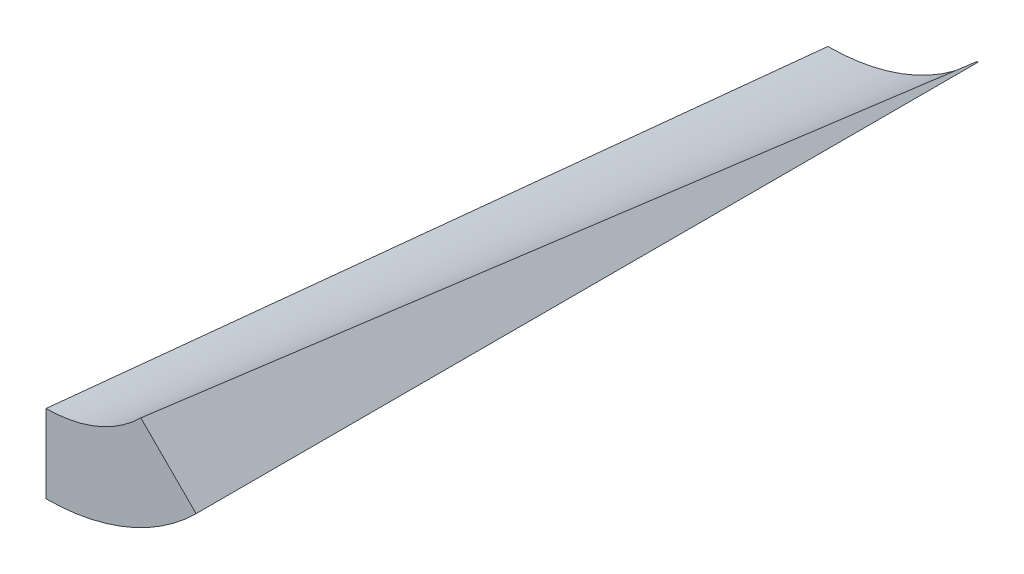
ISO-10303-21;
HEADER;
FILE_DESCRIPTION(('STEP AP214'),'2;1');
FILE_NAME('part.step','',(''),(''),'','','');
FILE_SCHEMA(('AUTOMOTIVE_DESIGN { 1 0 10303 214 1 1 1 1 }'));
ENDSEC;
DATA;
#1=APPLICATION_CONTEXT('core data for automotive mechanical design processes');
#2=APPLICATION_PROTOCOL_DEFINITION('international standard','automotive_design',2000,#1);
#3=PRODUCT_CONTEXT('',#1,'mechanical');
#4=PRODUCT('Part','Part','',(#3));
#5=PRODUCT_RELATED_PRODUCT_CATEGORY('part','',(#4));
#6=PRODUCT_DEFINITION_FORMATION('','',#4);
#7=PRODUCT_DEFINITION_CONTEXT('part definition',#1,'design');
#8=PRODUCT_DEFINITION('design','',#6,#7);
#9=PRODUCT_DEFINITION_SHAPE('','',#8);
#10=(LENGTH_UNIT() NAMED_UNIT(*) SI_UNIT(.MILLI.,.METRE.));
#11=(NAMED_UNIT(*) PLANE_ANGLE_UNIT() SI_UNIT($,.RADIAN.));
#12=(NAMED_UNIT(*) SI_UNIT($,.STERADIAN.) SOLID_ANGLE_UNIT());
#13=UNCERTAINTY_MEASURE_WITH_UNIT(LENGTH_MEASURE(1.E-05),#10,'distance_accuracy_value','');
#14=(GEOMETRIC_REPRESENTATION_CONTEXT(3) GLOBAL_UNCERTAINTY_ASSIGNED_CONTEXT((#13)) GLOBAL_UNIT_ASSIGNED_CONTEXT((#10,
#11,#12)) REPRESENTATION_CONTEXT('',''));
#15=CARTESIAN_POINT('',(0.,0.,0.));
#16=DIRECTION('',(0.,0.,1.));
#17=DIRECTION('',(1.,0.,0.));
#18=AXIS2_PLACEMENT_3D('',#15,#16,#17);
#19=CARTESIAN_POINT('',(0.,27.15,100.));
#20=DIRECTION('',(0.,0.,1.));
#21=DIRECTION('',(1.,0.,0.));
#22=AXIS2_PLACEMENT_3D('',#19,#20,#21);
#23=PLANE('',#22);
#24=CARTESIAN_POINT('',(0.,27.15,100.));
#25=DIRECTION('',(0.,0.,1.));
#26=DIRECTION('',(1.,0.,0.));
#27=AXIS2_PLACEMENT_3D('',#24,#25,#26);
#28=CIRCLE('',#27,27.15);
#29=CARTESIAN_POINT('',(0.,0.,100.));
#30=VERTEX_POINT('',#29);
#31=CARTESIAN_POINT('',(19.1979491092148,7.95205089078528,100.));
#32=VERTEX_POINT('',#31);
#33=EDGE_CURVE('E127',#30,#32,#28,.T.);
#34=ORIENTED_EDGE('',*,*,#33,.T.);
#35=DIRECTION('',(-0.70710678118655,0.707106781186545,0.));
#36=VECTOR('',#35,1.);
#37=CARTESIAN_POINT('',(12.1268812973493,15.0231187026507,100.));
#38=LINE('',#37,#36);
#39=CARTESIAN_POINT('',(12.1268812973493,15.0231187026507,100.));
#40=VERTEX_POINT('',#39);
#41=EDGE_CURVE('E175',#32,#40,#38,.T.);
#42=ORIENTED_EDGE('',*,*,#41,.T.);
#43=CARTESIAN_POINT('',(0.,27.15,100.));
#44=DIRECTION('',(0.,0.,-1.));
#45=DIRECTION('',(1.,0.,0.));
#46=AXIS2_PLACEMENT_3D('',#43,#44,#45);
#47=CIRCLE('',#46,17.15);
#48=CARTESIAN_POINT('',(0.,10.,100.));
#49=VERTEX_POINT('',#48);
#50=EDGE_CURVE('E63',#40,#49,#47,.T.);
#51=ORIENTED_EDGE('',*,*,#50,.T.);
#52=DIRECTION('',(0.,-1.,0.));
#53=VECTOR('',#52,1.);
#54=CARTESIAN_POINT('',(0.,10.,100.));
#55=LINE('',#54,#53);
#56=EDGE_CURVE('E12',#49,#30,#55,.T.);
#57=ORIENTED_EDGE('',*,*,#56,.T.);
#58=EDGE_LOOP('',(#34,#42,#51,#57));
#59=FACE_BOUND('',#58,.T.);
#60=ADVANCED_FACE('F53',(#59),#23,.T.);
#61=CARTESIAN_POINT('',(0.,27.15,0.));
#62=DIRECTION('',(0.,0.,1.));
#63=DIRECTION('',(1.,0.,0.));
#64=AXIS2_PLACEMENT_3D('',#61,#62,#63);
#65=PLANE('',#64);
#66=CARTESIAN_POINT('',(0.,27.15,0.));
#67=DIRECTION('',(0.,0.,1.));
#68=DIRECTION('',(1.,0.,0.));
#69=AXIS2_PLACEMENT_3D('',#66,#67,#68);
#70=CIRCLE('',#69,27.15);
#71=CARTESIAN_POINT('',(0.,0.,0.));
#72=VERTEX_POINT('',#71);
#73=CARTESIAN_POINT('',(19.1979491092148,7.95205089078528,0.));
#74=VERTEX_POINT('',#73);
#75=EDGE_CURVE('E105',#72,#74,#70,.T.);
#76=ORIENTED_EDGE('',*,*,#75,.F.);
#77=DIRECTION('',(0.,-1.,0.));
#78=VECTOR('',#77,1.);
#79=CARTESIAN_POINT('',(0.,0.0999999999999994,0.));
#80=LINE('',#79,#78);
#81=CARTESIAN_POINT('',(0.,0.0999999999999994,0.));
#82=VERTEX_POINT('',#81);
#83=EDGE_CURVE('E98',#82,#72,#80,.T.);
#84=ORIENTED_EDGE('',*,*,#83,.F.);
#85=CARTESIAN_POINT('',(0.,27.15,0.));
#86=DIRECTION('',(0.,0.,-1.));
#87=DIRECTION('',(1.,0.,0.));
#88=AXIS2_PLACEMENT_3D('',#85,#86,#87);
#89=CIRCLE('',#88,27.05);
#90=CARTESIAN_POINT('',(19.1272384310961,8.02276156890392,0.));
#91=VERTEX_POINT('',#90);
#92=EDGE_CURVE('E101',#91,#82,#89,.T.);
#93=ORIENTED_EDGE('',*,*,#92,.F.);
#94=DIRECTION('',(-0.707106781186669,0.707106781186426,0.));
#95=VECTOR('',#94,1.);
#96=CARTESIAN_POINT('',(19.1272384310961,8.02276156890392,0.));
#97=LINE('',#96,#95);
#98=EDGE_CURVE('E118',#74,#91,#97,.T.);
#99=ORIENTED_EDGE('',*,*,#98,.F.);
#100=EDGE_LOOP('',(#76,#84,#93,#99));
#101=FACE_BOUND('',#100,.T.);
#102=ADVANCED_FACE('F100',(#101),#65,.F.);
#103=CARTESIAN_POINT('',(13.575,13.5750000000001,0.));
#104=DIRECTION('',(-0.707106781186545,-0.70710678118655,0.));
#105=DIRECTION('',(0.70710678118655,-0.707106781186545,0.));
#106=AXIS2_PLACEMENT_3D('',#103,#104,#105);
#107=PLANE('',#106);
#108=DIRECTION('',(-0.0696630201084582,0.0696630201084581,0.9951352306389));
#109=VECTOR('',#108,1.);
#110=CARTESIAN_POINT('',(19.1272384310961,8.02276156890392,0.));
#111=LINE('',#110,#109);
#112=EDGE_CURVE('E110',#91,#40,#111,.T.);
#113=ORIENTED_EDGE('',*,*,#112,.T.);
#114=ORIENTED_EDGE('',*,*,#41,.F.);
#115=DIRECTION('',(0.,0.,1.));
#116=VECTOR('',#115,1.);
#117=CARTESIAN_POINT('',(19.1979491092148,7.95205089078528,0.));
#118=LINE('',#117,#116);
#119=EDGE_CURVE('E125',#74,#32,#118,.T.);
#120=ORIENTED_EDGE('',*,*,#119,.F.);
#121=ORIENTED_EDGE('',*,*,#98,.T.);
#122=EDGE_LOOP('',(#113,#114,#120,#121));
#123=FACE_BOUND('',#122,.T.);
#124=ADVANCED_FACE('F156',(#123),#107,.F.);
#125=CARTESIAN_POINT('',(0.,27.15,0.));
#126=DIRECTION('',(0.,0.,1.));
#127=DIRECTION('',(1.,0.,0.));
#128=AXIS2_PLACEMENT_3D('',#125,#126,#127);
#129=CYLINDRICAL_SURFACE('',#128,27.15);
#130=ORIENTED_EDGE('',*,*,#119,.T.);
#131=ORIENTED_EDGE('',*,*,#33,.F.);
#132=DIRECTION('',(0.,0.,1.));
#133=VECTOR('',#132,1.);
#134=CARTESIAN_POINT('',(0.,0.,0.));
#135=LINE('',#134,#133);
#136=EDGE_CURVE('E124',#72,#30,#135,.T.);
#137=ORIENTED_EDGE('',*,*,#136,.F.);
#138=ORIENTED_EDGE('',*,*,#75,.T.);
#139=EDGE_LOOP('',(#130,#131,#137,#138));
#140=FACE_BOUND('',#139,.T.);
#141=ADVANCED_FACE('F146',(#140),#129,.T.);
#142=CARTESIAN_POINT('',(0.,27.15,0.));
#143=DIRECTION('',(0.,0.,-1.));
#144=DIRECTION('',(-1.,0.,0.));
#145=AXIS2_PLACEMENT_3D('',#142,#143,#144);
#146=CONICAL_SURFACE('',#145,27.05,0.0986784557655753);
#147=DIRECTION('',(0.,0.0985183878332512,0.9951352306389));
#148=VECTOR('',#147,1.);
#149=CARTESIAN_POINT('',(0.,0.0999999999999994,0.));
#150=LINE('',#149,#148);
#151=EDGE_CURVE('E78',#82,#49,#150,.T.);
#152=ORIENTED_EDGE('',*,*,#151,.T.);
#153=ORIENTED_EDGE('',*,*,#50,.F.);
#154=ORIENTED_EDGE('',*,*,#112,.F.);
#155=ORIENTED_EDGE('',*,*,#92,.T.);
#156=EDGE_LOOP('',(#152,#153,#154,#155));
#157=FACE_BOUND('',#156,.T.);
#158=ADVANCED_FACE('F116',(#157),#146,.F.);
#159=CARTESIAN_POINT('',(0.,0.,0.));
#160=DIRECTION('',(1.,0.,0.));
#161=DIRECTION('',(0.,1.,0.));
#162=AXIS2_PLACEMENT_3D('',#159,#160,#161);
#163=PLANE('',#162);
#164=ORIENTED_EDGE('',*,*,#136,.T.);
#165=ORIENTED_EDGE('',*,*,#56,.F.);
#166=ORIENTED_EDGE('',*,*,#151,.F.);
#167=ORIENTED_EDGE('',*,*,#83,.T.);
#168=EDGE_LOOP('',(#164,#165,#166,#167));
#169=FACE_BOUND('',#168,.T.);
#170=ADVANCED_FACE('F122',(#169),#163,.F.);
#171=CLOSED_SHELL('',(#60,#102,#124,#141,#158,#170));
#172=MANIFOLD_SOLID_BREP('B2',#171);
#173=ADVANCED_BREP_SHAPE_REPRESENTATION('',(#18,#172),#14);
#174=SHAPE_DEFINITION_REPRESENTATION(#9,#173);
ENDSEC;
END-ISO-10303-21;
